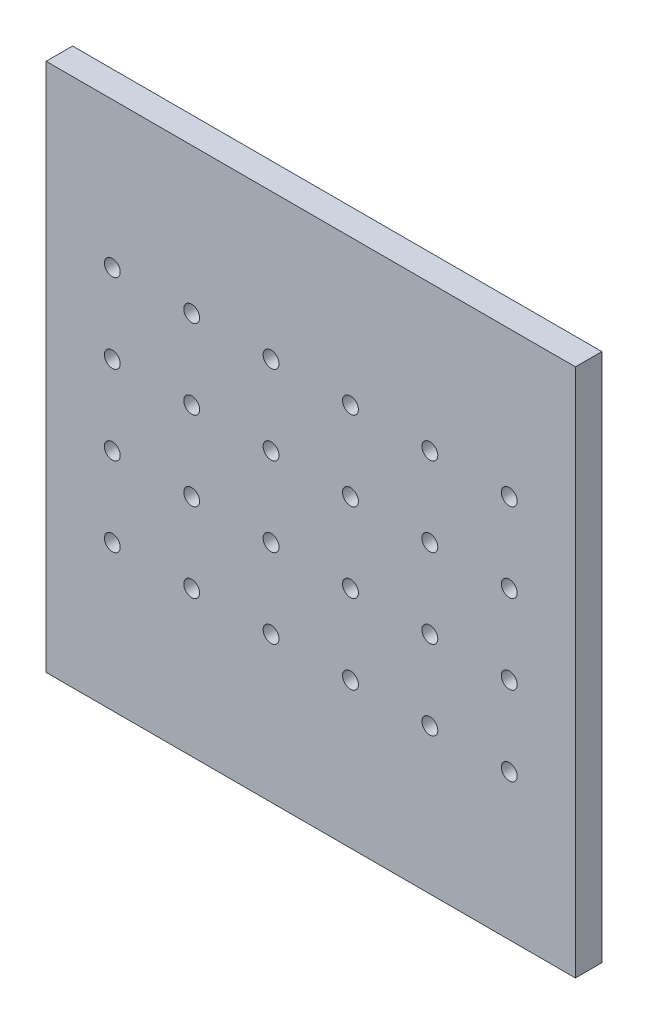
ISO-10303-21;
HEADER;
FILE_DESCRIPTION(('STEP AP214'),'2;1');
FILE_NAME('part.step','',(''),(''),'','','');
FILE_SCHEMA(('AUTOMOTIVE_DESIGN { 1 0 10303 214 1 1 1 1 }'));
ENDSEC;
DATA;
#1=APPLICATION_CONTEXT('core data for automotive mechanical design processes');
#2=APPLICATION_PROTOCOL_DEFINITION('international standard','automotive_design',2000,#1);
#3=PRODUCT_CONTEXT('',#1,'mechanical');
#4=PRODUCT('Part','Part','',(#3));
#5=PRODUCT_RELATED_PRODUCT_CATEGORY('part','',(#4));
#6=PRODUCT_DEFINITION_FORMATION('','',#4);
#7=PRODUCT_DEFINITION_CONTEXT('part definition',#1,'design');
#8=PRODUCT_DEFINITION('design','',#6,#7);
#9=PRODUCT_DEFINITION_SHAPE('','',#8);
#10=(LENGTH_UNIT() NAMED_UNIT(*) SI_UNIT(.MILLI.,.METRE.));
#11=(NAMED_UNIT(*) PLANE_ANGLE_UNIT() SI_UNIT($,.RADIAN.));
#12=(NAMED_UNIT(*) SI_UNIT($,.STERADIAN.) SOLID_ANGLE_UNIT());
#13=UNCERTAINTY_MEASURE_WITH_UNIT(LENGTH_MEASURE(1.E-05),#10,'distance_accuracy_value','');
#14=(GEOMETRIC_REPRESENTATION_CONTEXT(3) GLOBAL_UNCERTAINTY_ASSIGNED_CONTEXT((#13)) GLOBAL_UNIT_ASSIGNED_CONTEXT((#10,
#11,#12)) REPRESENTATION_CONTEXT('',''));
#15=CARTESIAN_POINT('',(0.,0.,0.));
#16=DIRECTION('',(0.,0.,1.));
#17=DIRECTION('',(1.,0.,0.));
#18=AXIS2_PLACEMENT_3D('',#15,#16,#17);
#19=CARTESIAN_POINT('',(75.,45.,0.));
#20=DIRECTION('',(0.,0.,-1.));
#21=DIRECTION('',(1.,0.,0.));
#22=AXIS2_PLACEMENT_3D('',#19,#20,#21);
#23=CYLINDRICAL_SURFACE('',#22,3.);
#24=CARTESIAN_POINT('',(75.,45.,0.));
#25=DIRECTION('',(0.,0.,1.));
#26=DIRECTION('',(1.,0.,0.));
#27=AXIS2_PLACEMENT_3D('',#24,#25,#26);
#28=CIRCLE('',#27,3.);
#29=CARTESIAN_POINT('',(78.,45.,0.));
#30=VERTEX_POINT('',#29);
#31=EDGE_CURVE('E307',#30,#30,#28,.T.);
#32=ORIENTED_EDGE('',*,*,#31,.F.);
#33=DIRECTION('',(0.,0.,1.));
#34=VECTOR('',#33,1.);
#35=CARTESIAN_POINT('',(78.,45.,0.));
#36=LINE('',#35,#34);
#37=CARTESIAN_POINT('',(78.,45.,10.));
#38=VERTEX_POINT('',#37);
#39=EDGE_CURVE('E10',#30,#38,#36,.T.);
#40=ORIENTED_EDGE('',*,*,#39,.T.);
#41=CARTESIAN_POINT('',(75.,45.,10.));
#42=DIRECTION('',(0.,0.,-1.));
#43=DIRECTION('',(1.,0.,0.));
#44=AXIS2_PLACEMENT_3D('',#41,#42,#43);
#45=CIRCLE('',#44,3.);
#46=EDGE_CURVE('E365',#38,#38,#45,.T.);
#47=ORIENTED_EDGE('',*,*,#46,.F.);
#48=ORIENTED_EDGE('',*,*,#39,.F.);
#49=EDGE_LOOP('',(#32,#40,#47,#48));
#50=FACE_BOUND('',#49,.T.);
#51=ADVANCED_FACE('F16',(#50),#23,.F.);
#52=CARTESIAN_POINT('',(45.,45.,0.));
#53=DIRECTION('',(0.,0.,-1.));
#54=DIRECTION('',(1.,0.,0.));
#55=AXIS2_PLACEMENT_3D('',#52,#53,#54);
#56=CYLINDRICAL_SURFACE('',#55,3.);
#57=CARTESIAN_POINT('',(45.,45.,0.));
#58=DIRECTION('',(0.,0.,1.));
#59=DIRECTION('',(1.,0.,0.));
#60=AXIS2_PLACEMENT_3D('',#57,#58,#59);
#61=CIRCLE('',#60,3.);
#62=CARTESIAN_POINT('',(48.,45.,0.));
#63=VERTEX_POINT('',#62);
#64=EDGE_CURVE('E303',#63,#63,#61,.T.);
#65=ORIENTED_EDGE('',*,*,#64,.F.);
#66=DIRECTION('',(0.,0.,1.));
#67=VECTOR('',#66,1.);
#68=CARTESIAN_POINT('',(48.,45.,0.));
#69=LINE('',#68,#67);
#70=CARTESIAN_POINT('',(48.,45.,10.));
#71=VERTEX_POINT('',#70);
#72=EDGE_CURVE('E24',#63,#71,#69,.T.);
#73=ORIENTED_EDGE('',*,*,#72,.T.);
#74=CARTESIAN_POINT('',(45.,45.,10.));
#75=DIRECTION('',(0.,0.,-1.));
#76=DIRECTION('',(1.,0.,0.));
#77=AXIS2_PLACEMENT_3D('',#74,#75,#76);
#78=CIRCLE('',#77,3.);
#79=EDGE_CURVE('E460',#71,#71,#78,.T.);
#80=ORIENTED_EDGE('',*,*,#79,.F.);
#81=ORIENTED_EDGE('',*,*,#72,.F.);
#82=EDGE_LOOP('',(#65,#73,#80,#81));
#83=FACE_BOUND('',#82,.T.);
#84=ADVANCED_FACE('F637',(#83),#56,.F.);
#85=CARTESIAN_POINT('',(15.,45.,0.));
#86=DIRECTION('',(0.,0.,-1.));
#87=DIRECTION('',(1.,0.,0.));
#88=AXIS2_PLACEMENT_3D('',#85,#86,#87);
#89=CYLINDRICAL_SURFACE('',#88,3.);
#90=CARTESIAN_POINT('',(15.,45.,0.));
#91=DIRECTION('',(0.,0.,1.));
#92=DIRECTION('',(1.,0.,0.));
#93=AXIS2_PLACEMENT_3D('',#90,#91,#92);
#94=CIRCLE('',#93,3.);
#95=CARTESIAN_POINT('',(18.,45.,0.));
#96=VERTEX_POINT('',#95);
#97=EDGE_CURVE('E308',#96,#96,#94,.T.);
#98=ORIENTED_EDGE('',*,*,#97,.F.);
#99=DIRECTION('',(0.,0.,1.));
#100=VECTOR('',#99,1.);
#101=CARTESIAN_POINT('',(18.,45.,0.));
#102=LINE('',#101,#100);
#103=CARTESIAN_POINT('',(18.,45.,10.));
#104=VERTEX_POINT('',#103);
#105=EDGE_CURVE('E340',#96,#104,#102,.T.);
#106=ORIENTED_EDGE('',*,*,#105,.T.);
#107=CARTESIAN_POINT('',(15.,45.,10.));
#108=DIRECTION('',(0.,0.,-1.));
#109=DIRECTION('',(1.,0.,0.));
#110=AXIS2_PLACEMENT_3D('',#107,#108,#109);
#111=CIRCLE('',#110,3.);
#112=EDGE_CURVE('E536',#104,#104,#111,.T.);
#113=ORIENTED_EDGE('',*,*,#112,.F.);
#114=ORIENTED_EDGE('',*,*,#105,.F.);
#115=EDGE_LOOP('',(#98,#106,#113,#114));
#116=FACE_BOUND('',#115,.T.);
#117=ADVANCED_FACE('F641',(#116),#89,.F.);
#118=CARTESIAN_POINT('',(75.,15.,0.));
#119=DIRECTION('',(0.,0.,-1.));
#120=DIRECTION('',(1.,0.,0.));
#121=AXIS2_PLACEMENT_3D('',#118,#119,#120);
#122=CYLINDRICAL_SURFACE('',#121,3.);
#123=CARTESIAN_POINT('',(75.,15.,0.));
#124=DIRECTION('',(0.,0.,1.));
#125=DIRECTION('',(1.,0.,0.));
#126=AXIS2_PLACEMENT_3D('',#123,#124,#125);
#127=CIRCLE('',#126,3.);
#128=CARTESIAN_POINT('',(78.,15.,0.));
#129=VERTEX_POINT('',#128);
#130=EDGE_CURVE('E453',#129,#129,#127,.T.);
#131=ORIENTED_EDGE('',*,*,#130,.F.);
#132=DIRECTION('',(0.,0.,1.));
#133=VECTOR('',#132,1.);
#134=CARTESIAN_POINT('',(78.,15.,0.));
#135=LINE('',#134,#133);
#136=CARTESIAN_POINT('',(78.,15.,10.));
#137=VERTEX_POINT('',#136);
#138=EDGE_CURVE('E337',#129,#137,#135,.T.);
#139=ORIENTED_EDGE('',*,*,#138,.T.);
#140=CARTESIAN_POINT('',(75.,15.,10.));
#141=DIRECTION('',(0.,0.,-1.));
#142=DIRECTION('',(1.,0.,0.));
#143=AXIS2_PLACEMENT_3D('',#140,#141,#142);
#144=CIRCLE('',#143,3.);
#145=EDGE_CURVE('E532',#137,#137,#144,.T.);
#146=ORIENTED_EDGE('',*,*,#145,.F.);
#147=ORIENTED_EDGE('',*,*,#138,.F.);
#148=EDGE_LOOP('',(#131,#139,#146,#147));
#149=FACE_BOUND('',#148,.T.);
#150=ADVANCED_FACE('F752',(#149),#122,.F.);
#151=CARTESIAN_POINT('',(45.,15.,0.));
#152=DIRECTION('',(0.,0.,-1.));
#153=DIRECTION('',(1.,0.,0.));
#154=AXIS2_PLACEMENT_3D('',#151,#152,#153);
#155=CYLINDRICAL_SURFACE('',#154,3.);
#156=CARTESIAN_POINT('',(45.,15.,0.));
#157=DIRECTION('',(0.,0.,1.));
#158=DIRECTION('',(1.,0.,0.));
#159=AXIS2_PLACEMENT_3D('',#156,#157,#158);
#160=CIRCLE('',#159,3.);
#161=CARTESIAN_POINT('',(48.,15.,0.));
#162=VERTEX_POINT('',#161);
#163=EDGE_CURVE('E445',#162,#162,#160,.T.);
#164=ORIENTED_EDGE('',*,*,#163,.F.);
#165=DIRECTION('',(0.,0.,1.));
#166=VECTOR('',#165,1.);
#167=CARTESIAN_POINT('',(48.,15.,0.));
#168=LINE('',#167,#166);
#169=CARTESIAN_POINT('',(48.,15.,10.));
#170=VERTEX_POINT('',#169);
#171=EDGE_CURVE('E341',#162,#170,#168,.T.);
#172=ORIENTED_EDGE('',*,*,#171,.T.);
#173=CARTESIAN_POINT('',(45.,15.,10.));
#174=DIRECTION('',(0.,0.,-1.));
#175=DIRECTION('',(1.,0.,0.));
#176=AXIS2_PLACEMENT_3D('',#173,#174,#175);
#177=CIRCLE('',#176,3.);
#178=EDGE_CURVE('E478',#170,#170,#177,.T.);
#179=ORIENTED_EDGE('',*,*,#178,.F.);
#180=ORIENTED_EDGE('',*,*,#171,.F.);
#181=EDGE_LOOP('',(#164,#172,#179,#180));
#182=FACE_BOUND('',#181,.T.);
#183=ADVANCED_FACE('F750',(#182),#155,.F.);
#184=CARTESIAN_POINT('',(15.,15.,0.));
#185=DIRECTION('',(0.,0.,-1.));
#186=DIRECTION('',(1.,0.,0.));
#187=AXIS2_PLACEMENT_3D('',#184,#185,#186);
#188=CYLINDRICAL_SURFACE('',#187,3.);
#189=CARTESIAN_POINT('',(15.,15.,0.));
#190=DIRECTION('',(0.,0.,1.));
#191=DIRECTION('',(1.,0.,0.));
#192=AXIS2_PLACEMENT_3D('',#189,#190,#191);
#193=CIRCLE('',#192,3.);
#194=CARTESIAN_POINT('',(18.,15.,0.));
#195=VERTEX_POINT('',#194);
#196=EDGE_CURVE('E441',#195,#195,#193,.T.);
#197=ORIENTED_EDGE('',*,*,#196,.F.);
#198=DIRECTION('',(0.,0.,1.));
#199=VECTOR('',#198,1.);
#200=CARTESIAN_POINT('',(18.,15.,0.));
#201=LINE('',#200,#199);
#202=CARTESIAN_POINT('',(18.,15.,10.));
#203=VERTEX_POINT('',#202);
#204=EDGE_CURVE('E454',#195,#203,#201,.T.);
#205=ORIENTED_EDGE('',*,*,#204,.T.);
#206=CARTESIAN_POINT('',(15.,15.,10.));
#207=DIRECTION('',(0.,0.,-1.));
#208=DIRECTION('',(1.,0.,0.));
#209=AXIS2_PLACEMENT_3D('',#206,#207,#208);
#210=CIRCLE('',#209,3.);
#211=EDGE_CURVE('E474',#203,#203,#210,.T.);
#212=ORIENTED_EDGE('',*,*,#211,.F.);
#213=ORIENTED_EDGE('',*,*,#204,.F.);
#214=EDGE_LOOP('',(#197,#205,#212,#213));
#215=FACE_BOUND('',#214,.T.);
#216=ADVANCED_FACE('F747',(#215),#188,.F.);
#217=CARTESIAN_POINT('',(-15.,45.,0.));
#218=DIRECTION('',(0.,0.,-1.));
#219=DIRECTION('',(1.,0.,0.));
#220=AXIS2_PLACEMENT_3D('',#217,#218,#219);
#221=CYLINDRICAL_SURFACE('',#220,3.);
#222=CARTESIAN_POINT('',(-15.,45.,0.));
#223=DIRECTION('',(0.,0.,1.));
#224=DIRECTION('',(1.,0.,0.));
#225=AXIS2_PLACEMENT_3D('',#222,#223,#224);
#226=CIRCLE('',#225,3.);
#227=CARTESIAN_POINT('',(-12.,45.,0.));
#228=VERTEX_POINT('',#227);
#229=EDGE_CURVE('E432',#228,#228,#226,.T.);
#230=ORIENTED_EDGE('',*,*,#229,.F.);
#231=DIRECTION('',(0.,0.,1.));
#232=VECTOR('',#231,1.);
#233=CARTESIAN_POINT('',(-12.,45.,0.));
#234=LINE('',#233,#232);
#235=CARTESIAN_POINT('',(-12.,45.,10.));
#236=VERTEX_POINT('',#235);
#237=EDGE_CURVE('E457',#228,#236,#234,.T.);
#238=ORIENTED_EDGE('',*,*,#237,.T.);
#239=CARTESIAN_POINT('',(-15.,45.,10.));
#240=DIRECTION('',(0.,0.,-1.));
#241=DIRECTION('',(1.,0.,0.));
#242=AXIS2_PLACEMENT_3D('',#239,#240,#241);
#243=CIRCLE('',#242,3.);
#244=EDGE_CURVE('E437',#236,#236,#243,.T.);
#245=ORIENTED_EDGE('',*,*,#244,.F.);
#246=ORIENTED_EDGE('',*,*,#237,.F.);
#247=EDGE_LOOP('',(#230,#238,#245,#246));
#248=FACE_BOUND('',#247,.T.);
#249=ADVANCED_FACE('F578',(#248),#221,.F.);
#250=CARTESIAN_POINT('',(-45.,45.,0.));
#251=DIRECTION('',(0.,0.,-1.));
#252=DIRECTION('',(1.,0.,0.));
#253=AXIS2_PLACEMENT_3D('',#250,#251,#252);
#254=CYLINDRICAL_SURFACE('',#253,3.);
#255=CARTESIAN_POINT('',(-45.,45.,0.));
#256=DIRECTION('',(0.,0.,1.));
#257=DIRECTION('',(1.,0.,0.));
#258=AXIS2_PLACEMENT_3D('',#255,#256,#257);
#259=CIRCLE('',#258,3.);
#260=CARTESIAN_POINT('',(-42.,45.,0.));
#261=VERTEX_POINT('',#260);
#262=EDGE_CURVE('E428',#261,#261,#259,.T.);
#263=ORIENTED_EDGE('',*,*,#262,.F.);
#264=DIRECTION('',(0.,0.,1.));
#265=VECTOR('',#264,1.);
#266=CARTESIAN_POINT('',(-42.,45.,0.));
#267=LINE('',#266,#265);
#268=CARTESIAN_POINT('',(-42.,45.,10.));
#269=VERTEX_POINT('',#268);
#270=EDGE_CURVE('E559',#261,#269,#267,.T.);
#271=ORIENTED_EDGE('',*,*,#270,.T.);
#272=CARTESIAN_POINT('',(-45.,45.,10.));
#273=DIRECTION('',(0.,0.,-1.));
#274=DIRECTION('',(1.,0.,0.));
#275=AXIS2_PLACEMENT_3D('',#272,#273,#274);
#276=CIRCLE('',#275,3.);
#277=EDGE_CURVE('E433',#269,#269,#276,.T.);
#278=ORIENTED_EDGE('',*,*,#277,.F.);
#279=ORIENTED_EDGE('',*,*,#270,.F.);
#280=EDGE_LOOP('',(#263,#271,#278,#279));
#281=FACE_BOUND('',#280,.T.);
#282=ADVANCED_FACE('F740',(#281),#254,.F.);
#283=CARTESIAN_POINT('',(-75.,45.,0.));
#284=DIRECTION('',(0.,0.,-1.));
#285=DIRECTION('',(1.,0.,0.));
#286=AXIS2_PLACEMENT_3D('',#283,#284,#285);
#287=CYLINDRICAL_SURFACE('',#286,3.);
#288=CARTESIAN_POINT('',(-75.,45.,0.));
#289=DIRECTION('',(0.,0.,1.));
#290=DIRECTION('',(1.,0.,0.));
#291=AXIS2_PLACEMENT_3D('',#288,#289,#290);
#292=CIRCLE('',#291,3.);
#293=CARTESIAN_POINT('',(-72.,45.,0.));
#294=VERTEX_POINT('',#293);
#295=EDGE_CURVE('E424',#294,#294,#292,.T.);
#296=ORIENTED_EDGE('',*,*,#295,.F.);
#297=DIRECTION('',(0.,0.,1.));
#298=VECTOR('',#297,1.);
#299=CARTESIAN_POINT('',(-72.,45.,0.));
#300=LINE('',#299,#298);
#301=CARTESIAN_POINT('',(-72.,45.,10.));
#302=VERTEX_POINT('',#301);
#303=EDGE_CURVE('E556',#294,#302,#300,.T.);
#304=ORIENTED_EDGE('',*,*,#303,.T.);
#305=CARTESIAN_POINT('',(-75.,45.,10.));
#306=DIRECTION('',(0.,0.,-1.));
#307=DIRECTION('',(1.,0.,0.));
#308=AXIS2_PLACEMENT_3D('',#305,#306,#307);
#309=CIRCLE('',#308,3.);
#310=EDGE_CURVE('E399',#302,#302,#309,.T.);
#311=ORIENTED_EDGE('',*,*,#310,.F.);
#312=ORIENTED_EDGE('',*,*,#303,.F.);
#313=EDGE_LOOP('',(#296,#304,#311,#312));
#314=FACE_BOUND('',#313,.T.);
#315=ADVANCED_FACE('F717',(#314),#287,.F.);
#316=CARTESIAN_POINT('',(-15.,15.,0.));
#317=DIRECTION('',(0.,0.,-1.));
#318=DIRECTION('',(1.,0.,0.));
#319=AXIS2_PLACEMENT_3D('',#316,#317,#318);
#320=CYLINDRICAL_SURFACE('',#319,3.);
#321=CARTESIAN_POINT('',(-15.,15.,0.));
#322=DIRECTION('',(0.,0.,1.));
#323=DIRECTION('',(1.,0.,0.));
#324=AXIS2_PLACEMENT_3D('',#321,#322,#323);
#325=CIRCLE('',#324,3.);
#326=CARTESIAN_POINT('',(-12.,15.,0.));
#327=VERTEX_POINT('',#326);
#328=EDGE_CURVE('E420',#327,#327,#325,.T.);
#329=ORIENTED_EDGE('',*,*,#328,.F.);
#330=DIRECTION('',(0.,0.,1.));
#331=VECTOR('',#330,1.);
#332=CARTESIAN_POINT('',(-12.,15.,0.));
#333=LINE('',#332,#331);
#334=CARTESIAN_POINT('',(-12.,15.,10.));
#335=VERTEX_POINT('',#334);
#336=EDGE_CURVE('E560',#327,#335,#333,.T.);
#337=ORIENTED_EDGE('',*,*,#336,.T.);
#338=CARTESIAN_POINT('',(-15.,15.,10.));
#339=DIRECTION('',(0.,0.,-1.));
#340=DIRECTION('',(1.,0.,0.));
#341=AXIS2_PLACEMENT_3D('',#338,#339,#340);
#342=CIRCLE('',#341,3.);
#343=EDGE_CURVE('E395',#335,#335,#342,.T.);
#344=ORIENTED_EDGE('',*,*,#343,.F.);
#345=ORIENTED_EDGE('',*,*,#336,.F.);
#346=EDGE_LOOP('',(#329,#337,#344,#345));
#347=FACE_BOUND('',#346,.T.);
#348=ADVANCED_FACE('F713',(#347),#320,.F.);
#349=CARTESIAN_POINT('',(-45.,15.,0.));
#350=DIRECTION('',(0.,0.,-1.));
#351=DIRECTION('',(1.,0.,0.));
#352=AXIS2_PLACEMENT_3D('',#349,#350,#351);
#353=CYLINDRICAL_SURFACE('',#352,3.);
#354=CARTESIAN_POINT('',(-45.,15.,0.));
#355=DIRECTION('',(0.,0.,1.));
#356=DIRECTION('',(1.,0.,0.));
#357=AXIS2_PLACEMENT_3D('',#354,#355,#356);
#358=CIRCLE('',#357,3.);
#359=CARTESIAN_POINT('',(-42.,15.,0.));
#360=VERTEX_POINT('',#359);
#361=EDGE_CURVE('E416',#360,#360,#358,.T.);
#362=ORIENTED_EDGE('',*,*,#361,.F.);
#363=DIRECTION('',(0.,0.,1.));
#364=VECTOR('',#363,1.);
#365=CARTESIAN_POINT('',(-42.,15.,0.));
#366=LINE('',#365,#364);
#367=CARTESIAN_POINT('',(-42.,15.,10.));
#368=VERTEX_POINT('',#367);
#369=EDGE_CURVE('E567',#360,#368,#366,.T.);
#370=ORIENTED_EDGE('',*,*,#369,.T.);
#371=CARTESIAN_POINT('',(-45.,15.,10.));
#372=DIRECTION('',(0.,0.,-1.));
#373=DIRECTION('',(1.,0.,0.));
#374=AXIS2_PLACEMENT_3D('',#371,#372,#373);
#375=CIRCLE('',#374,3.);
#376=EDGE_CURVE('E400',#368,#368,#375,.T.);
#377=ORIENTED_EDGE('',*,*,#376,.F.);
#378=ORIENTED_EDGE('',*,*,#369,.F.);
#379=EDGE_LOOP('',(#362,#370,#377,#378));
#380=FACE_BOUND('',#379,.T.);
#381=ADVANCED_FACE('F716',(#380),#353,.F.);
#382=CARTESIAN_POINT('',(-75.,15.,0.));
#383=DIRECTION('',(0.,0.,-1.));
#384=DIRECTION('',(1.,0.,0.));
#385=AXIS2_PLACEMENT_3D('',#382,#383,#384);
#386=CYLINDRICAL_SURFACE('',#385,3.);
#387=CARTESIAN_POINT('',(-75.,15.,0.));
#388=DIRECTION('',(0.,0.,1.));
#389=DIRECTION('',(1.,0.,0.));
#390=AXIS2_PLACEMENT_3D('',#387,#388,#389);
#391=CIRCLE('',#390,3.);
#392=CARTESIAN_POINT('',(-72.,15.,0.));
#393=VERTEX_POINT('',#392);
#394=EDGE_CURVE('E412',#393,#393,#391,.T.);
#395=ORIENTED_EDGE('',*,*,#394,.F.);
#396=DIRECTION('',(0.,0.,1.));
#397=VECTOR('',#396,1.);
#398=CARTESIAN_POINT('',(-72.,15.,0.));
#399=LINE('',#398,#397);
#400=CARTESIAN_POINT('',(-72.,15.,10.));
#401=VERTEX_POINT('',#400);
#402=EDGE_CURVE('E299',#393,#401,#399,.T.);
#403=ORIENTED_EDGE('',*,*,#402,.T.);
#404=CARTESIAN_POINT('',(-75.,15.,10.));
#405=DIRECTION('',(0.,0.,-1.));
#406=DIRECTION('',(1.,0.,0.));
#407=AXIS2_PLACEMENT_3D('',#404,#405,#406);
#408=CIRCLE('',#407,3.);
#409=EDGE_CURVE('E516',#401,#401,#408,.T.);
#410=ORIENTED_EDGE('',*,*,#409,.F.);
#411=ORIENTED_EDGE('',*,*,#402,.F.);
#412=EDGE_LOOP('',(#395,#403,#410,#411));
#413=FACE_BOUND('',#412,.T.);
#414=ADVANCED_FACE('F730',(#413),#386,.F.);
#415=CARTESIAN_POINT('',(75.,-15.,0.));
#416=DIRECTION('',(0.,0.,-1.));
#417=DIRECTION('',(1.,0.,0.));
#418=AXIS2_PLACEMENT_3D('',#415,#416,#417);
#419=CYLINDRICAL_SURFACE('',#418,3.);
#420=CARTESIAN_POINT('',(75.,-15.,0.));
#421=DIRECTION('',(0.,0.,1.));
#422=DIRECTION('',(1.,0.,0.));
#423=AXIS2_PLACEMENT_3D('',#420,#421,#422);
#424=CIRCLE('',#423,3.);
#425=CARTESIAN_POINT('',(78.,-15.,0.));
#426=VERTEX_POINT('',#425);
#427=EDGE_CURVE('E408',#426,#426,#424,.T.);
#428=ORIENTED_EDGE('',*,*,#427,.F.);
#429=DIRECTION('',(0.,0.,1.));
#430=VECTOR('',#429,1.);
#431=CARTESIAN_POINT('',(78.,-15.,0.));
#432=LINE('',#431,#430);
#433=CARTESIAN_POINT('',(78.,-15.,10.));
#434=VERTEX_POINT('',#433);
#435=EDGE_CURVE('E296',#426,#434,#432,.T.);
#436=ORIENTED_EDGE('',*,*,#435,.T.);
#437=CARTESIAN_POINT('',(75.,-15.,10.));
#438=DIRECTION('',(0.,0.,-1.));
#439=DIRECTION('',(1.,0.,0.));
#440=AXIS2_PLACEMENT_3D('',#437,#438,#439);
#441=CIRCLE('',#440,3.);
#442=EDGE_CURVE('E470',#434,#434,#441,.T.);
#443=ORIENTED_EDGE('',*,*,#442,.F.);
#444=ORIENTED_EDGE('',*,*,#435,.F.);
#445=EDGE_LOOP('',(#428,#436,#443,#444));
#446=FACE_BOUND('',#445,.T.);
#447=ADVANCED_FACE('F726',(#446),#419,.F.);
#448=CARTESIAN_POINT('',(45.,-15.,0.));
#449=DIRECTION('',(0.,0.,-1.));
#450=DIRECTION('',(1.,0.,0.));
#451=AXIS2_PLACEMENT_3D('',#448,#449,#450);
#452=CYLINDRICAL_SURFACE('',#451,3.);
#453=CARTESIAN_POINT('',(45.,-15.,0.));
#454=DIRECTION('',(0.,0.,1.));
#455=DIRECTION('',(1.,0.,0.));
#456=AXIS2_PLACEMENT_3D('',#453,#454,#455);
#457=CIRCLE('',#456,3.);
#458=CARTESIAN_POINT('',(48.,-15.,0.));
#459=VERTEX_POINT('',#458);
#460=EDGE_CURVE('E404',#459,#459,#457,.T.);
#461=ORIENTED_EDGE('',*,*,#460,.F.);
#462=DIRECTION('',(0.,0.,1.));
#463=VECTOR('',#462,1.);
#464=CARTESIAN_POINT('',(48.,-15.,0.));
#465=LINE('',#464,#463);
#466=CARTESIAN_POINT('',(48.,-15.,10.));
#467=VERTEX_POINT('',#466);
#468=EDGE_CURVE('E300',#459,#467,#465,.T.);
#469=ORIENTED_EDGE('',*,*,#468,.T.);
#470=CARTESIAN_POINT('',(45.,-15.,10.));
#471=DIRECTION('',(0.,0.,-1.));
#472=DIRECTION('',(1.,0.,0.));
#473=AXIS2_PLACEMENT_3D('',#470,#471,#472);
#474=CIRCLE('',#473,3.);
#475=EDGE_CURVE('E466',#467,#467,#474,.T.);
#476=ORIENTED_EDGE('',*,*,#475,.F.);
#477=ORIENTED_EDGE('',*,*,#468,.F.);
#478=EDGE_LOOP('',(#461,#469,#476,#477));
#479=FACE_BOUND('',#478,.T.);
#480=ADVANCED_FACE('F723',(#479),#452,.F.);
#481=CARTESIAN_POINT('',(15.,-15.,0.));
#482=DIRECTION('',(0.,0.,-1.));
#483=DIRECTION('',(1.,0.,0.));
#484=AXIS2_PLACEMENT_3D('',#481,#482,#483);
#485=CYLINDRICAL_SURFACE('',#484,3.);
#486=CARTESIAN_POINT('',(15.,-15.,0.));
#487=DIRECTION('',(0.,0.,1.));
#488=DIRECTION('',(1.,0.,0.));
#489=AXIS2_PLACEMENT_3D('',#486,#487,#488);
#490=CIRCLE('',#489,3.);
#491=CARTESIAN_POINT('',(18.,-15.,0.));
#492=VERTEX_POINT('',#491);
#493=EDGE_CURVE('E394',#492,#492,#490,.T.);
#494=ORIENTED_EDGE('',*,*,#493,.F.);
#495=DIRECTION('',(0.,0.,1.));
#496=VECTOR('',#495,1.);
#497=CARTESIAN_POINT('',(18.,-15.,0.));
#498=LINE('',#497,#496);
#499=CARTESIAN_POINT('',(18.,-15.,10.));
#500=VERTEX_POINT('',#499);
#501=EDGE_CURVE('E380',#492,#500,#498,.T.);
#502=ORIENTED_EDGE('',*,*,#501,.T.);
#503=CARTESIAN_POINT('',(15.,-15.,10.));
#504=DIRECTION('',(0.,0.,-1.));
#505=DIRECTION('',(1.,0.,0.));
#506=AXIS2_PLACEMENT_3D('',#503,#504,#505);
#507=CIRCLE('',#506,3.);
#508=EDGE_CURVE('E314',#500,#500,#507,.T.);
#509=ORIENTED_EDGE('',*,*,#508,.F.);
#510=ORIENTED_EDGE('',*,*,#501,.F.);
#511=EDGE_LOOP('',(#494,#502,#509,#510));
#512=FACE_BOUND('',#511,.T.);
#513=ADVANCED_FACE('F721',(#512),#485,.F.);
#514=CARTESIAN_POINT('',(75.,-45.,0.));
#515=DIRECTION('',(0.,0.,-1.));
#516=DIRECTION('',(1.,0.,0.));
#517=AXIS2_PLACEMENT_3D('',#514,#515,#516);
#518=CYLINDRICAL_SURFACE('',#517,3.);
#519=CARTESIAN_POINT('',(75.,-45.,0.));
#520=DIRECTION('',(0.,0.,1.));
#521=DIRECTION('',(1.,0.,0.));
#522=AXIS2_PLACEMENT_3D('',#519,#520,#521);
#523=CIRCLE('',#522,3.);
#524=CARTESIAN_POINT('',(78.,-45.,0.));
#525=VERTEX_POINT('',#524);
#526=EDGE_CURVE('E390',#525,#525,#523,.T.);
#527=ORIENTED_EDGE('',*,*,#526,.F.);
#528=DIRECTION('',(0.,0.,1.));
#529=VECTOR('',#528,1.);
#530=CARTESIAN_POINT('',(78.,-45.,0.));
#531=LINE('',#530,#529);
#532=CARTESIAN_POINT('',(78.,-45.,10.));
#533=VERTEX_POINT('',#532);
#534=EDGE_CURVE('E355',#525,#533,#531,.T.);
#535=ORIENTED_EDGE('',*,*,#534,.T.);
#536=CARTESIAN_POINT('',(75.,-45.,10.));
#537=DIRECTION('',(0.,0.,-1.));
#538=DIRECTION('',(1.,0.,0.));
#539=AXIS2_PLACEMENT_3D('',#536,#537,#538);
#540=CIRCLE('',#539,3.);
#541=EDGE_CURVE('E311',#533,#533,#540,.T.);
#542=ORIENTED_EDGE('',*,*,#541,.F.);
#543=ORIENTED_EDGE('',*,*,#534,.F.);
#544=EDGE_LOOP('',(#527,#535,#542,#543));
#545=FACE_BOUND('',#544,.T.);
#546=ADVANCED_FACE('F707',(#545),#518,.F.);
#547=CARTESIAN_POINT('',(45.,-45.,0.));
#548=DIRECTION('',(0.,0.,-1.));
#549=DIRECTION('',(1.,0.,0.));
#550=AXIS2_PLACEMENT_3D('',#547,#548,#549);
#551=CYLINDRICAL_SURFACE('',#550,3.);
#552=CARTESIAN_POINT('',(45.,-45.,0.));
#553=DIRECTION('',(0.,0.,1.));
#554=DIRECTION('',(1.,0.,0.));
#555=AXIS2_PLACEMENT_3D('',#552,#553,#554);
#556=CIRCLE('',#555,3.);
#557=CARTESIAN_POINT('',(48.,-45.,0.));
#558=VERTEX_POINT('',#557);
#559=EDGE_CURVE('E386',#558,#558,#556,.T.);
#560=ORIENTED_EDGE('',*,*,#559,.F.);
#561=DIRECTION('',(0.,0.,1.));
#562=VECTOR('',#561,1.);
#563=CARTESIAN_POINT('',(48.,-45.,0.));
#564=LINE('',#563,#562);
#565=CARTESIAN_POINT('',(48.,-45.,10.));
#566=VERTEX_POINT('',#565);
#567=EDGE_CURVE('E352',#558,#566,#564,.T.);
#568=ORIENTED_EDGE('',*,*,#567,.T.);
#569=CARTESIAN_POINT('',(45.,-45.,10.));
#570=DIRECTION('',(0.,0.,-1.));
#571=DIRECTION('',(1.,0.,0.));
#572=AXIS2_PLACEMENT_3D('',#569,#570,#571);
#573=CIRCLE('',#572,3.);
#574=EDGE_CURVE('E315',#566,#566,#573,.T.);
#575=ORIENTED_EDGE('',*,*,#574,.F.);
#576=ORIENTED_EDGE('',*,*,#567,.F.);
#577=EDGE_LOOP('',(#560,#568,#575,#576));
#578=FACE_BOUND('',#577,.T.);
#579=ADVANCED_FACE('F703',(#578),#551,.F.);
#580=CARTESIAN_POINT('',(15.,-45.,0.));
#581=DIRECTION('',(0.,0.,-1.));
#582=DIRECTION('',(1.,0.,0.));
#583=AXIS2_PLACEMENT_3D('',#580,#581,#582);
#584=CYLINDRICAL_SURFACE('',#583,3.);
#585=CARTESIAN_POINT('',(15.,-45.,0.));
#586=DIRECTION('',(0.,0.,1.));
#587=DIRECTION('',(1.,0.,0.));
#588=AXIS2_PLACEMENT_3D('',#585,#586,#587);
#589=CIRCLE('',#588,3.);
#590=CARTESIAN_POINT('',(18.,-45.,0.));
#591=VERTEX_POINT('',#590);
#592=EDGE_CURVE('E379',#591,#591,#589,.T.);
#593=ORIENTED_EDGE('',*,*,#592,.F.);
#594=DIRECTION('',(0.,0.,1.));
#595=VECTOR('',#594,1.);
#596=CARTESIAN_POINT('',(18.,-45.,0.));
#597=LINE('',#596,#595);
#598=CARTESIAN_POINT('',(18.,-45.,10.));
#599=VERTEX_POINT('',#598);
#600=EDGE_CURVE('E356',#591,#599,#597,.T.);
#601=ORIENTED_EDGE('',*,*,#600,.T.);
#602=CARTESIAN_POINT('',(15.,-45.,10.));
#603=DIRECTION('',(0.,0.,-1.));
#604=DIRECTION('',(1.,0.,0.));
#605=AXIS2_PLACEMENT_3D('',#602,#603,#604);
#606=CIRCLE('',#605,3.);
#607=EDGE_CURVE('E375',#599,#599,#606,.T.);
#608=ORIENTED_EDGE('',*,*,#607,.F.);
#609=ORIENTED_EDGE('',*,*,#600,.F.);
#610=EDGE_LOOP('',(#593,#601,#608,#609));
#611=FACE_BOUND('',#610,.T.);
#612=ADVANCED_FACE('F706',(#611),#584,.F.);
#613=CARTESIAN_POINT('',(-15.,-15.,0.));
#614=DIRECTION('',(0.,0.,-1.));
#615=DIRECTION('',(1.,0.,0.));
#616=AXIS2_PLACEMENT_3D('',#613,#614,#615);
#617=CYLINDRICAL_SURFACE('',#616,3.);
#618=CARTESIAN_POINT('',(-15.,-15.,0.));
#619=DIRECTION('',(0.,0.,1.));
#620=DIRECTION('',(1.,0.,0.));
#621=AXIS2_PLACEMENT_3D('',#618,#619,#620);
#622=CIRCLE('',#621,3.);
#623=CARTESIAN_POINT('',(-12.,-15.,0.));
#624=VERTEX_POINT('',#623);
#625=EDGE_CURVE('E350',#624,#624,#622,.T.);
#626=ORIENTED_EDGE('',*,*,#625,.F.);
#627=DIRECTION('',(0.,0.,1.));
#628=VECTOR('',#627,1.);
#629=CARTESIAN_POINT('',(-12.,-15.,0.));
#630=LINE('',#629,#628);
#631=CARTESIAN_POINT('',(-12.,-15.,10.));
#632=VERTEX_POINT('',#631);
#633=EDGE_CURVE('E446',#624,#632,#630,.T.);
#634=ORIENTED_EDGE('',*,*,#633,.T.);
#635=CARTESIAN_POINT('',(-15.,-15.,10.));
#636=DIRECTION('',(0.,0.,-1.));
#637=DIRECTION('',(1.,0.,0.));
#638=AXIS2_PLACEMENT_3D('',#635,#636,#637);
#639=CIRCLE('',#638,3.);
#640=EDGE_CURVE('E503',#632,#632,#639,.T.);
#641=ORIENTED_EDGE('',*,*,#640,.F.);
#642=ORIENTED_EDGE('',*,*,#633,.F.);
#643=EDGE_LOOP('',(#626,#634,#641,#642));
#644=FACE_BOUND('',#643,.T.);
#645=ADVANCED_FACE('F711',(#644),#617,.F.);
#646=CARTESIAN_POINT('',(-45.,-15.,0.));
#647=DIRECTION('',(0.,0.,-1.));
#648=DIRECTION('',(1.,0.,0.));
#649=AXIS2_PLACEMENT_3D('',#646,#647,#648);
#650=CYLINDRICAL_SURFACE('',#649,3.);
#651=CARTESIAN_POINT('',(-45.,-15.,0.));
#652=DIRECTION('',(0.,0.,1.));
#653=DIRECTION('',(1.,0.,0.));
#654=AXIS2_PLACEMENT_3D('',#651,#652,#653);
#655=CIRCLE('',#654,3.);
#656=CARTESIAN_POINT('',(-42.,-15.,0.));
#657=VERTEX_POINT('',#656);
#658=EDGE_CURVE('E346',#657,#657,#655,.T.);
#659=ORIENTED_EDGE('',*,*,#658,.F.);
#660=DIRECTION('',(0.,0.,1.));
#661=VECTOR('',#660,1.);
#662=CARTESIAN_POINT('',(-42.,-15.,0.));
#663=LINE('',#662,#661);
#664=CARTESIAN_POINT('',(-42.,-15.,10.));
#665=VERTEX_POINT('',#664);
#666=EDGE_CURVE('E449',#657,#665,#663,.T.);
#667=ORIENTED_EDGE('',*,*,#666,.T.);
#668=CARTESIAN_POINT('',(-45.,-15.,10.));
#669=DIRECTION('',(0.,0.,-1.));
#670=DIRECTION('',(1.,0.,0.));
#671=AXIS2_PLACEMENT_3D('',#668,#669,#670);
#672=CIRCLE('',#671,3.);
#673=EDGE_CURVE('E499',#665,#665,#672,.T.);
#674=ORIENTED_EDGE('',*,*,#673,.F.);
#675=ORIENTED_EDGE('',*,*,#666,.F.);
#676=EDGE_LOOP('',(#659,#667,#674,#675));
#677=FACE_BOUND('',#676,.T.);
#678=ADVANCED_FACE('F701',(#677),#650,.F.);
#679=CARTESIAN_POINT('',(-75.,-15.,0.));
#680=DIRECTION('',(0.,0.,-1.));
#681=DIRECTION('',(1.,0.,0.));
#682=AXIS2_PLACEMENT_3D('',#679,#680,#681);
#683=CYLINDRICAL_SURFACE('',#682,3.);
#684=CARTESIAN_POINT('',(-75.,-15.,0.));
#685=DIRECTION('',(0.,0.,1.));
#686=DIRECTION('',(1.,0.,0.));
#687=AXIS2_PLACEMENT_3D('',#684,#685,#686);
#688=CIRCLE('',#687,3.);
#689=CARTESIAN_POINT('',(-72.,-15.,0.));
#690=VERTEX_POINT('',#689);
#691=EDGE_CURVE('E351',#690,#690,#688,.T.);
#692=ORIENTED_EDGE('',*,*,#691,.F.);
#693=DIRECTION('',(0.,0.,1.));
#694=VECTOR('',#693,1.);
#695=CARTESIAN_POINT('',(-72.,-15.,0.));
#696=LINE('',#695,#694);
#697=CARTESIAN_POINT('',(-72.,-15.,10.));
#698=VERTEX_POINT('',#697);
#699=EDGE_CURVE('E547',#690,#698,#696,.T.);
#700=ORIENTED_EDGE('',*,*,#699,.T.);
#701=CARTESIAN_POINT('',(-75.,-15.,10.));
#702=DIRECTION('',(0.,0.,-1.));
#703=DIRECTION('',(1.,0.,0.));
#704=AXIS2_PLACEMENT_3D('',#701,#702,#703);
#705=CIRCLE('',#704,3.);
#706=EDGE_CURVE('E493',#698,#698,#705,.T.);
#707=ORIENTED_EDGE('',*,*,#706,.F.);
#708=ORIENTED_EDGE('',*,*,#699,.F.);
#709=EDGE_LOOP('',(#692,#700,#707,#708));
#710=FACE_BOUND('',#709,.T.);
#711=ADVANCED_FACE('F695',(#710),#683,.F.);
#712=CARTESIAN_POINT('',(-15.,-45.,0.));
#713=DIRECTION('',(0.,0.,-1.));
#714=DIRECTION('',(1.,0.,0.));
#715=AXIS2_PLACEMENT_3D('',#712,#713,#714);
#716=CYLINDRICAL_SURFACE('',#715,3.);
#717=CARTESIAN_POINT('',(-15.,-45.,0.));
#718=DIRECTION('',(0.,0.,1.));
#719=DIRECTION('',(1.,0.,0.));
#720=AXIS2_PLACEMENT_3D('',#717,#718,#719);
#721=CIRCLE('',#720,3.);
#722=CARTESIAN_POINT('',(-12.,-45.,0.));
#723=VERTEX_POINT('',#722);
#724=EDGE_CURVE('E360',#723,#723,#721,.T.);
#725=ORIENTED_EDGE('',*,*,#724,.F.);
#726=DIRECTION('',(0.,0.,1.));
#727=VECTOR('',#726,1.);
#728=CARTESIAN_POINT('',(-12.,-45.,0.));
#729=LINE('',#728,#727);
#730=CARTESIAN_POINT('',(-12.,-45.,10.));
#731=VERTEX_POINT('',#730);
#732=EDGE_CURVE('E544',#723,#731,#729,.T.);
#733=ORIENTED_EDGE('',*,*,#732,.T.);
#734=CARTESIAN_POINT('',(-15.,-45.,10.));
#735=DIRECTION('',(0.,0.,-1.));
#736=DIRECTION('',(1.,0.,0.));
#737=AXIS2_PLACEMENT_3D('',#734,#735,#736);
#738=CIRCLE('',#737,3.);
#739=EDGE_CURVE('E489',#731,#731,#738,.T.);
#740=ORIENTED_EDGE('',*,*,#739,.F.);
#741=ORIENTED_EDGE('',*,*,#732,.F.);
#742=EDGE_LOOP('',(#725,#733,#740,#741));
#743=FACE_BOUND('',#742,.T.);
#744=ADVANCED_FACE('F691',(#743),#716,.F.);
#745=CARTESIAN_POINT('',(-45.,-45.,0.));
#746=DIRECTION('',(0.,0.,-1.));
#747=DIRECTION('',(1.,0.,0.));
#748=AXIS2_PLACEMENT_3D('',#745,#746,#747);
#749=CYLINDRICAL_SURFACE('',#748,3.);
#750=CARTESIAN_POINT('',(-45.,-45.,0.));
#751=DIRECTION('',(0.,0.,1.));
#752=DIRECTION('',(1.,0.,0.));
#753=AXIS2_PLACEMENT_3D('',#750,#751,#752);
#754=CIRCLE('',#753,3.);
#755=CARTESIAN_POINT('',(-42.,-45.,0.));
#756=VERTEX_POINT('',#755);
#757=EDGE_CURVE('E345',#756,#756,#754,.T.);
#758=ORIENTED_EDGE('',*,*,#757,.F.);
#759=DIRECTION('',(0.,0.,1.));
#760=VECTOR('',#759,1.);
#761=CARTESIAN_POINT('',(-42.,-45.,0.));
#762=LINE('',#761,#760);
#763=CARTESIAN_POINT('',(-42.,-45.,10.));
#764=VERTEX_POINT('',#763);
#765=EDGE_CURVE('E364',#756,#764,#762,.T.);
#766=ORIENTED_EDGE('',*,*,#765,.T.);
#767=CARTESIAN_POINT('',(-45.,-45.,10.));
#768=DIRECTION('',(0.,0.,-1.));
#769=DIRECTION('',(1.,0.,0.));
#770=AXIS2_PLACEMENT_3D('',#767,#768,#769);
#771=CIRCLE('',#770,3.);
#772=EDGE_CURVE('E485',#764,#764,#771,.T.);
#773=ORIENTED_EDGE('',*,*,#772,.F.);
#774=ORIENTED_EDGE('',*,*,#765,.F.);
#775=EDGE_LOOP('',(#758,#766,#773,#774));
#776=FACE_BOUND('',#775,.T.);
#777=ADVANCED_FACE('F631',(#776),#749,.F.);
#778=CARTESIAN_POINT('',(-75.,-45.,0.));
#779=DIRECTION('',(0.,0.,-1.));
#780=DIRECTION('',(1.,0.,0.));
#781=AXIS2_PLACEMENT_3D('',#778,#779,#780);
#782=CYLINDRICAL_SURFACE('',#781,3.);
#783=CARTESIAN_POINT('',(-75.,-45.,0.));
#784=DIRECTION('',(0.,0.,1.));
#785=DIRECTION('',(1.,0.,0.));
#786=AXIS2_PLACEMENT_3D('',#783,#784,#785);
#787=CIRCLE('',#786,3.);
#788=CARTESIAN_POINT('',(-72.,-45.,0.));
#789=VERTEX_POINT('',#788);
#790=EDGE_CURVE('E333',#789,#789,#787,.T.);
#791=ORIENTED_EDGE('',*,*,#790,.F.);
#792=DIRECTION('',(0.,0.,1.));
#793=VECTOR('',#792,1.);
#794=CARTESIAN_POINT('',(-72.,-45.,0.));
#795=LINE('',#794,#793);
#796=CARTESIAN_POINT('',(-72.,-45.,10.));
#797=VERTEX_POINT('',#796);
#798=EDGE_CURVE('E361',#789,#797,#795,.T.);
#799=ORIENTED_EDGE('',*,*,#798,.T.);
#800=CARTESIAN_POINT('',(-75.,-45.,10.));
#801=DIRECTION('',(0.,0.,-1.));
#802=DIRECTION('',(1.,0.,0.));
#803=AXIS2_PLACEMENT_3D('',#800,#801,#802);
#804=CIRCLE('',#803,3.);
#805=EDGE_CURVE('E481',#797,#797,#804,.T.);
#806=ORIENTED_EDGE('',*,*,#805,.F.);
#807=ORIENTED_EDGE('',*,*,#798,.F.);
#808=EDGE_LOOP('',(#791,#799,#806,#807));
#809=FACE_BOUND('',#808,.T.);
#810=ADVANCED_FACE('F625',(#809),#782,.F.);
#811=CARTESIAN_POINT('',(100.,100.,0.));
#812=DIRECTION('',(0.,-1.,0.));
#813=DIRECTION('',(0.,0.,-1.));
#814=AXIS2_PLACEMENT_3D('',#811,#812,#813);
#815=PLANE('',#814);
#816=DIRECTION('',(-1.,0.,0.));
#817=VECTOR('',#816,1.);
#818=CARTESIAN_POINT('',(100.,100.,0.));
#819=LINE('',#818,#817);
#820=CARTESIAN_POINT('',(100.,100.,0.));
#821=VERTEX_POINT('',#820);
#822=CARTESIAN_POINT('',(-100.,100.,0.));
#823=VERTEX_POINT('',#822);
#824=EDGE_CURVE('E330',#821,#823,#819,.T.);
#825=ORIENTED_EDGE('',*,*,#824,.T.);
#826=DIRECTION('',(0.,0.,1.));
#827=VECTOR('',#826,1.);
#828=CARTESIAN_POINT('',(-100.,100.,0.));
#829=LINE('',#828,#827);
#830=CARTESIAN_POINT('',(-100.,100.,10.));
#831=VERTEX_POINT('',#830);
#832=EDGE_CURVE('E270',#823,#831,#829,.T.);
#833=ORIENTED_EDGE('',*,*,#832,.T.);
#834=DIRECTION('',(-1.,0.,0.));
#835=VECTOR('',#834,1.);
#836=CARTESIAN_POINT('',(100.,100.,10.));
#837=LINE('',#836,#835);
#838=CARTESIAN_POINT('',(100.,100.,10.));
#839=VERTEX_POINT('',#838);
#840=EDGE_CURVE('E327',#839,#831,#837,.T.);
#841=ORIENTED_EDGE('',*,*,#840,.F.);
#842=DIRECTION('',(0.,0.,1.));
#843=VECTOR('',#842,1.);
#844=CARTESIAN_POINT('',(100.,100.,0.));
#845=LINE('',#844,#843);
#846=EDGE_CURVE('E317',#821,#839,#845,.T.);
#847=ORIENTED_EDGE('',*,*,#846,.F.);
#848=EDGE_LOOP('',(#825,#833,#841,#847));
#849=FACE_BOUND('',#848,.T.);
#850=ADVANCED_FACE('F583',(#849),#815,.F.);
#851=CARTESIAN_POINT('',(0.,0.,10.));
#852=DIRECTION('',(0.,0.,1.));
#853=DIRECTION('',(1.,0.,0.));
#854=AXIS2_PLACEMENT_3D('',#851,#852,#853);
#855=PLANE('',#854);
#856=ORIENTED_EDGE('',*,*,#46,.T.);
#857=EDGE_LOOP('',(#856));
#858=FACE_BOUND('',#857,.T.);
#859=ORIENTED_EDGE('',*,*,#79,.T.);
#860=EDGE_LOOP('',(#859));
#861=FACE_BOUND('',#860,.T.);
#862=ORIENTED_EDGE('',*,*,#112,.T.);
#863=EDGE_LOOP('',(#862));
#864=FACE_BOUND('',#863,.T.);
#865=ORIENTED_EDGE('',*,*,#145,.T.);
#866=EDGE_LOOP('',(#865));
#867=FACE_BOUND('',#866,.T.);
#868=ORIENTED_EDGE('',*,*,#178,.T.);
#869=EDGE_LOOP('',(#868));
#870=FACE_BOUND('',#869,.T.);
#871=ORIENTED_EDGE('',*,*,#211,.T.);
#872=EDGE_LOOP('',(#871));
#873=FACE_BOUND('',#872,.T.);
#874=ORIENTED_EDGE('',*,*,#244,.T.);
#875=EDGE_LOOP('',(#874));
#876=FACE_BOUND('',#875,.T.);
#877=ORIENTED_EDGE('',*,*,#277,.T.);
#878=EDGE_LOOP('',(#877));
#879=FACE_BOUND('',#878,.T.);
#880=ORIENTED_EDGE('',*,*,#310,.T.);
#881=EDGE_LOOP('',(#880));
#882=FACE_BOUND('',#881,.T.);
#883=ORIENTED_EDGE('',*,*,#343,.T.);
#884=EDGE_LOOP('',(#883));
#885=FACE_BOUND('',#884,.T.);
#886=ORIENTED_EDGE('',*,*,#376,.T.);
#887=EDGE_LOOP('',(#886));
#888=FACE_BOUND('',#887,.T.);
#889=ORIENTED_EDGE('',*,*,#409,.T.);
#890=EDGE_LOOP('',(#889));
#891=FACE_BOUND('',#890,.T.);
#892=ORIENTED_EDGE('',*,*,#442,.T.);
#893=EDGE_LOOP('',(#892));
#894=FACE_BOUND('',#893,.T.);
#895=ORIENTED_EDGE('',*,*,#475,.T.);
#896=EDGE_LOOP('',(#895));
#897=FACE_BOUND('',#896,.T.);
#898=ORIENTED_EDGE('',*,*,#508,.T.);
#899=EDGE_LOOP('',(#898));
#900=FACE_BOUND('',#899,.T.);
#901=ORIENTED_EDGE('',*,*,#541,.T.);
#902=EDGE_LOOP('',(#901));
#903=FACE_BOUND('',#902,.T.);
#904=ORIENTED_EDGE('',*,*,#574,.T.);
#905=EDGE_LOOP('',(#904));
#906=FACE_BOUND('',#905,.T.);
#907=ORIENTED_EDGE('',*,*,#607,.T.);
#908=EDGE_LOOP('',(#907));
#909=FACE_BOUND('',#908,.T.);
#910=ORIENTED_EDGE('',*,*,#640,.T.);
#911=EDGE_LOOP('',(#910));
#912=FACE_BOUND('',#911,.T.);
#913=ORIENTED_EDGE('',*,*,#673,.T.);
#914=EDGE_LOOP('',(#913));
#915=FACE_BOUND('',#914,.T.);
#916=ORIENTED_EDGE('',*,*,#706,.T.);
#917=EDGE_LOOP('',(#916));
#918=FACE_BOUND('',#917,.T.);
#919=ORIENTED_EDGE('',*,*,#739,.T.);
#920=EDGE_LOOP('',(#919));
#921=FACE_BOUND('',#920,.T.);
#922=ORIENTED_EDGE('',*,*,#772,.T.);
#923=EDGE_LOOP('',(#922));
#924=FACE_BOUND('',#923,.T.);
#925=ORIENTED_EDGE('',*,*,#805,.T.);
#926=EDGE_LOOP('',(#925));
#927=FACE_BOUND('',#926,.T.);
#928=DIRECTION('',(1.,0.,0.));
#929=VECTOR('',#928,1.);
#930=CARTESIAN_POINT('',(-100.,-100.,10.));
#931=LINE('',#930,#929);
#932=CARTESIAN_POINT('',(-100.,-100.,10.));
#933=VERTEX_POINT('',#932);
#934=CARTESIAN_POINT('',(100.,-100.,10.));
#935=VERTEX_POINT('',#934);
#936=EDGE_CURVE('E282',#933,#935,#931,.T.);
#937=ORIENTED_EDGE('',*,*,#936,.T.);
#938=DIRECTION('',(0.,1.,0.));
#939=VECTOR('',#938,1.);
#940=CARTESIAN_POINT('',(100.,-100.,10.));
#941=LINE('',#940,#939);
#942=EDGE_CURVE('E321',#935,#839,#941,.T.);
#943=ORIENTED_EDGE('',*,*,#942,.T.);
#944=ORIENTED_EDGE('',*,*,#840,.T.);
#945=DIRECTION('',(0.,-1.,0.));
#946=VECTOR('',#945,1.);
#947=CARTESIAN_POINT('',(-100.,100.,10.));
#948=LINE('',#947,#946);
#949=EDGE_CURVE('E274',#831,#933,#948,.T.);
#950=ORIENTED_EDGE('',*,*,#949,.T.);
#951=EDGE_LOOP('',(#937,#943,#944,#950));
#952=FACE_BOUND('',#951,.T.);
#953=ADVANCED_FACE('F580',(#858,#861,#864,#867,#870,#873,#876,#879,#882,#885,#888,#891,#894,
#897,#900,#903,#906,#909,#912,#915,#918,#921,#924,#927,#952),#855,.T.);
#954=CARTESIAN_POINT('',(0.,0.,0.));
#955=DIRECTION('',(0.,0.,1.));
#956=DIRECTION('',(1.,0.,0.));
#957=AXIS2_PLACEMENT_3D('',#954,#955,#956);
#958=PLANE('',#957);
#959=ORIENTED_EDGE('',*,*,#31,.T.);
#960=EDGE_LOOP('',(#959));
#961=FACE_BOUND('',#960,.T.);
#962=ORIENTED_EDGE('',*,*,#64,.T.);
#963=EDGE_LOOP('',(#962));
#964=FACE_BOUND('',#963,.T.);
#965=ORIENTED_EDGE('',*,*,#97,.T.);
#966=EDGE_LOOP('',(#965));
#967=FACE_BOUND('',#966,.T.);
#968=ORIENTED_EDGE('',*,*,#130,.T.);
#969=EDGE_LOOP('',(#968));
#970=FACE_BOUND('',#969,.T.);
#971=ORIENTED_EDGE('',*,*,#163,.T.);
#972=EDGE_LOOP('',(#971));
#973=FACE_BOUND('',#972,.T.);
#974=ORIENTED_EDGE('',*,*,#196,.T.);
#975=EDGE_LOOP('',(#974));
#976=FACE_BOUND('',#975,.T.);
#977=ORIENTED_EDGE('',*,*,#229,.T.);
#978=EDGE_LOOP('',(#977));
#979=FACE_BOUND('',#978,.T.);
#980=ORIENTED_EDGE('',*,*,#262,.T.);
#981=EDGE_LOOP('',(#980));
#982=FACE_BOUND('',#981,.T.);
#983=ORIENTED_EDGE('',*,*,#295,.T.);
#984=EDGE_LOOP('',(#983));
#985=FACE_BOUND('',#984,.T.);
#986=ORIENTED_EDGE('',*,*,#328,.T.);
#987=EDGE_LOOP('',(#986));
#988=FACE_BOUND('',#987,.T.);
#989=ORIENTED_EDGE('',*,*,#361,.T.);
#990=EDGE_LOOP('',(#989));
#991=FACE_BOUND('',#990,.T.);
#992=ORIENTED_EDGE('',*,*,#394,.T.);
#993=EDGE_LOOP('',(#992));
#994=FACE_BOUND('',#993,.T.);
#995=ORIENTED_EDGE('',*,*,#427,.T.);
#996=EDGE_LOOP('',(#995));
#997=FACE_BOUND('',#996,.T.);
#998=ORIENTED_EDGE('',*,*,#460,.T.);
#999=EDGE_LOOP('',(#998));
#1000=FACE_BOUND('',#999,.T.);
#1001=ORIENTED_EDGE('',*,*,#493,.T.);
#1002=EDGE_LOOP('',(#1001));
#1003=FACE_BOUND('',#1002,.T.);
#1004=ORIENTED_EDGE('',*,*,#526,.T.);
#1005=EDGE_LOOP('',(#1004));
#1006=FACE_BOUND('',#1005,.T.);
#1007=ORIENTED_EDGE('',*,*,#559,.T.);
#1008=EDGE_LOOP('',(#1007));
#1009=FACE_BOUND('',#1008,.T.);
#1010=ORIENTED_EDGE('',*,*,#592,.T.);
#1011=EDGE_LOOP('',(#1010));
#1012=FACE_BOUND('',#1011,.T.);
#1013=ORIENTED_EDGE('',*,*,#625,.T.);
#1014=EDGE_LOOP('',(#1013));
#1015=FACE_BOUND('',#1014,.T.);
#1016=ORIENTED_EDGE('',*,*,#658,.T.);
#1017=EDGE_LOOP('',(#1016));
#1018=FACE_BOUND('',#1017,.T.);
#1019=ORIENTED_EDGE('',*,*,#691,.T.);
#1020=EDGE_LOOP('',(#1019));
#1021=FACE_BOUND('',#1020,.T.);
#1022=ORIENTED_EDGE('',*,*,#724,.T.);
#1023=EDGE_LOOP('',(#1022));
#1024=FACE_BOUND('',#1023,.T.);
#1025=ORIENTED_EDGE('',*,*,#757,.T.);
#1026=EDGE_LOOP('',(#1025));
#1027=FACE_BOUND('',#1026,.T.);
#1028=ORIENTED_EDGE('',*,*,#790,.T.);
#1029=EDGE_LOOP('',(#1028));
#1030=FACE_BOUND('',#1029,.T.);
#1031=DIRECTION('',(0.,-1.,0.));
#1032=VECTOR('',#1031,1.);
#1033=CARTESIAN_POINT('',(-100.,100.,0.));
#1034=LINE('',#1033,#1032);
#1035=CARTESIAN_POINT('',(-100.,-100.,0.));
#1036=VERTEX_POINT('',#1035);
#1037=EDGE_CURVE('E263',#823,#1036,#1034,.T.);
#1038=ORIENTED_EDGE('',*,*,#1037,.F.);
#1039=ORIENTED_EDGE('',*,*,#824,.F.);
#1040=DIRECTION('',(0.,1.,0.));
#1041=VECTOR('',#1040,1.);
#1042=CARTESIAN_POINT('',(100.,-100.,0.));
#1043=LINE('',#1042,#1041);
#1044=CARTESIAN_POINT('',(100.,-100.,0.));
#1045=VERTEX_POINT('',#1044);
#1046=EDGE_CURVE('E287',#1045,#821,#1043,.T.);
#1047=ORIENTED_EDGE('',*,*,#1046,.F.);
#1048=DIRECTION('',(1.,0.,0.));
#1049=VECTOR('',#1048,1.);
#1050=CARTESIAN_POINT('',(-100.,-100.,0.));
#1051=LINE('',#1050,#1049);
#1052=EDGE_CURVE('E280',#1036,#1045,#1051,.T.);
#1053=ORIENTED_EDGE('',*,*,#1052,.F.);
#1054=EDGE_LOOP('',(#1038,#1039,#1047,#1053));
#1055=FACE_BOUND('',#1054,.T.);
#1056=ADVANCED_FACE('F285',(#961,#964,#967,#970,#973,#976,#979,#982,#985,#988,#991,#994,#997,
#1000,#1003,#1006,#1009,#1012,#1015,#1018,#1021,#1024,#1027,#1030,#1055),#958,.F.);
#1057=CARTESIAN_POINT('',(100.,-100.,0.));
#1058=DIRECTION('',(-1.,0.,0.));
#1059=DIRECTION('',(0.,0.,1.));
#1060=AXIS2_PLACEMENT_3D('',#1057,#1058,#1059);
#1061=PLANE('',#1060);
#1062=ORIENTED_EDGE('',*,*,#1046,.T.);
#1063=ORIENTED_EDGE('',*,*,#846,.T.);
#1064=ORIENTED_EDGE('',*,*,#942,.F.);
#1065=DIRECTION('',(0.,0.,1.));
#1066=VECTOR('',#1065,1.);
#1067=CARTESIAN_POINT('',(100.,-100.,0.));
#1068=LINE('',#1067,#1066);
#1069=EDGE_CURVE('E290',#1045,#935,#1068,.T.);
#1070=ORIENTED_EDGE('',*,*,#1069,.F.);
#1071=EDGE_LOOP('',(#1062,#1063,#1064,#1070));
#1072=FACE_BOUND('',#1071,.T.);
#1073=ADVANCED_FACE('F621',(#1072),#1061,.F.);
#1074=CARTESIAN_POINT('',(-100.,100.,0.));
#1075=DIRECTION('',(1.,0.,0.));
#1076=DIRECTION('',(0.,1.,0.));
#1077=AXIS2_PLACEMENT_3D('',#1074,#1075,#1076);
#1078=PLANE('',#1077);
#1079=ORIENTED_EDGE('',*,*,#1037,.T.);
#1080=DIRECTION('',(0.,0.,1.));
#1081=VECTOR('',#1080,1.);
#1082=CARTESIAN_POINT('',(-100.,-100.,0.));
#1083=LINE('',#1082,#1081);
#1084=EDGE_CURVE('E267',#1036,#933,#1083,.T.);
#1085=ORIENTED_EDGE('',*,*,#1084,.T.);
#1086=ORIENTED_EDGE('',*,*,#949,.F.);
#1087=ORIENTED_EDGE('',*,*,#832,.F.);
#1088=EDGE_LOOP('',(#1079,#1085,#1086,#1087));
#1089=FACE_BOUND('',#1088,.T.);
#1090=ADVANCED_FACE('F265',(#1089),#1078,.F.);
#1091=CARTESIAN_POINT('',(-100.,-100.,0.));
#1092=DIRECTION('',(0.,1.,0.));
#1093=DIRECTION('',(1.,0.,0.));
#1094=AXIS2_PLACEMENT_3D('',#1091,#1092,#1093);
#1095=PLANE('',#1094);
#1096=ORIENTED_EDGE('',*,*,#1052,.T.);
#1097=ORIENTED_EDGE('',*,*,#1069,.T.);
#1098=ORIENTED_EDGE('',*,*,#936,.F.);
#1099=ORIENTED_EDGE('',*,*,#1084,.F.);
#1100=EDGE_LOOP('',(#1096,#1097,#1098,#1099));
#1101=FACE_BOUND('',#1100,.T.);
#1102=ADVANCED_FACE('F278',(#1101),#1095,.F.);
#1103=CLOSED_SHELL('',(#51,#84,#117,#150,#183,#216,#249,#282,#315,#348,#381,#414,#447,#480,#513,
#546,#579,#612,#645,#678,#711,#744,#777,#810,#850,#953,#1056,#1073,#1090,#1102));
#1104=MANIFOLD_SOLID_BREP('B1',#1103);
#1105=ADVANCED_BREP_SHAPE_REPRESENTATION('',(#18,#1104),#14);
#1106=SHAPE_DEFINITION_REPRESENTATION(#9,#1105);
ENDSEC;
END-ISO-10303-21;
